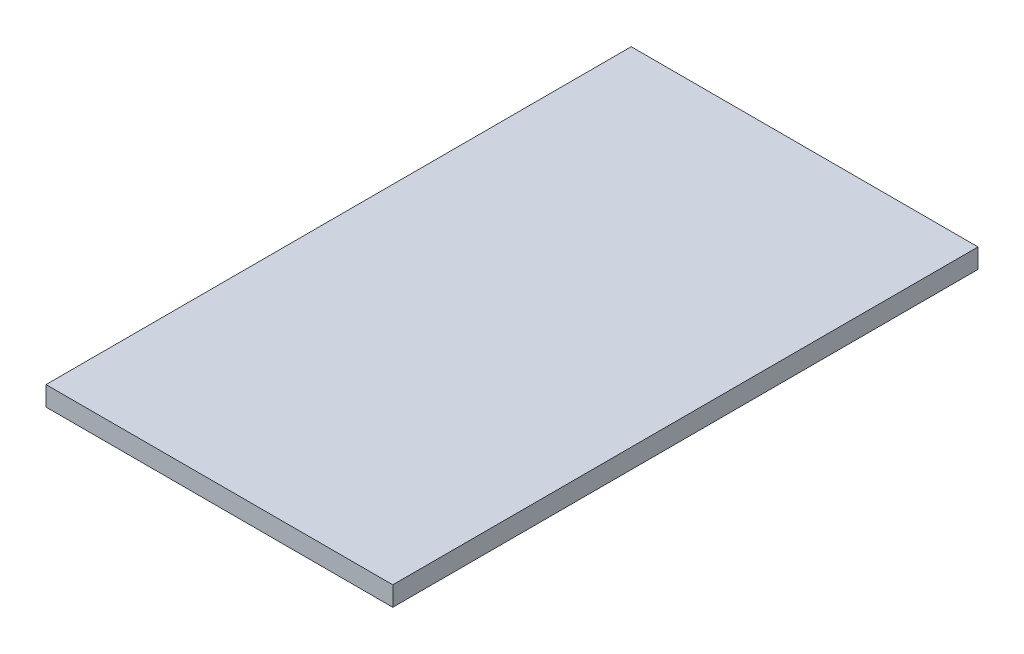
ISO-10303-21;
HEADER;
FILE_DESCRIPTION(('STEP AP214'),'2;1');
FILE_NAME('part.step','',(''),(''),'','','');
FILE_SCHEMA(('AUTOMOTIVE_DESIGN { 1 0 10303 214 1 1 1 1 }'));
ENDSEC;
DATA;
#1=APPLICATION_CONTEXT('core data for automotive mechanical design processes');
#2=APPLICATION_PROTOCOL_DEFINITION('international standard','automotive_design',2000,#1);
#3=PRODUCT_CONTEXT('',#1,'mechanical');
#4=PRODUCT('Part','Part','',(#3));
#5=PRODUCT_RELATED_PRODUCT_CATEGORY('part','',(#4));
#6=PRODUCT_DEFINITION_FORMATION('','',#4);
#7=PRODUCT_DEFINITION_CONTEXT('part definition',#1,'design');
#8=PRODUCT_DEFINITION('design','',#6,#7);
#9=PRODUCT_DEFINITION_SHAPE('','',#8);
#10=(LENGTH_UNIT() NAMED_UNIT(*) SI_UNIT(.MILLI.,.METRE.));
#11=(NAMED_UNIT(*) PLANE_ANGLE_UNIT() SI_UNIT($,.RADIAN.));
#12=(NAMED_UNIT(*) SI_UNIT($,.STERADIAN.) SOLID_ANGLE_UNIT());
#13=UNCERTAINTY_MEASURE_WITH_UNIT(LENGTH_MEASURE(1.E-05),#10,'distance_accuracy_value','');
#14=(GEOMETRIC_REPRESENTATION_CONTEXT(3) GLOBAL_UNCERTAINTY_ASSIGNED_CONTEXT((#13)) GLOBAL_UNIT_ASSIGNED_CONTEXT((#10,
#11,#12)) REPRESENTATION_CONTEXT('',''));
#15=CARTESIAN_POINT('',(0.,0.,0.));
#16=DIRECTION('',(0.,0.,1.));
#17=DIRECTION('',(1.,0.,0.));
#18=AXIS2_PLACEMENT_3D('',#15,#16,#17);
#19=CARTESIAN_POINT('',(-80.,4.5,-135.));
#20=DIRECTION('',(1.,0.,0.));
#21=DIRECTION('',(0.,0.,-1.));
#22=AXIS2_PLACEMENT_3D('',#19,#20,#21);
#23=PLANE('',#22);
#24=DIRECTION('',(0.,0.,1.));
#25=VECTOR('',#24,1.);
#26=CARTESIAN_POINT('',(-80.,-4.5,-135.));
#27=LINE('',#26,#25);
#28=CARTESIAN_POINT('',(-80.,-4.5,-135.));
#29=VERTEX_POINT('',#28);
#30=CARTESIAN_POINT('',(-80.,-4.5,135.));
#31=VERTEX_POINT('',#30);
#32=EDGE_CURVE('E97',#29,#31,#27,.T.);
#33=ORIENTED_EDGE('',*,*,#32,.T.);
#34=DIRECTION('',(0.,-1.,0.));
#35=VECTOR('',#34,1.);
#36=CARTESIAN_POINT('',(-80.,4.5,135.));
#37=LINE('',#36,#35);
#38=CARTESIAN_POINT('',(-80.,4.5,135.));
#39=VERTEX_POINT('',#38);
#40=EDGE_CURVE('E11',#39,#31,#37,.T.);
#41=ORIENTED_EDGE('',*,*,#40,.F.);
#42=DIRECTION('',(0.,0.,1.));
#43=VECTOR('',#42,1.);
#44=CARTESIAN_POINT('',(-80.,4.5,-135.));
#45=LINE('',#44,#43);
#46=CARTESIAN_POINT('',(-80.,4.5,-135.));
#47=VERTEX_POINT('',#46);
#48=EDGE_CURVE('E85',#47,#39,#45,.T.);
#49=ORIENTED_EDGE('',*,*,#48,.F.);
#50=DIRECTION('',(0.,-1.,0.));
#51=VECTOR('',#50,1.);
#52=CARTESIAN_POINT('',(-80.,4.5,-135.));
#53=LINE('',#52,#51);
#54=EDGE_CURVE('E93',#47,#29,#53,.T.);
#55=ORIENTED_EDGE('',*,*,#54,.T.);
#56=EDGE_LOOP('',(#33,#41,#49,#55));
#57=FACE_BOUND('',#56,.T.);
#58=ADVANCED_FACE('F34',(#57),#23,.F.);
#59=CARTESIAN_POINT('',(-80.,4.5,135.));
#60=DIRECTION('',(0.,0.,-1.));
#61=DIRECTION('',(-1.,0.,0.));
#62=AXIS2_PLACEMENT_3D('',#59,#60,#61);
#63=PLANE('',#62);
#64=DIRECTION('',(1.,0.,0.));
#65=VECTOR('',#64,1.);
#66=CARTESIAN_POINT('',(-80.,-4.5,135.));
#67=LINE('',#66,#65);
#68=CARTESIAN_POINT('',(80.,-4.5,135.));
#69=VERTEX_POINT('',#68);
#70=EDGE_CURVE('E89',#31,#69,#67,.T.);
#71=ORIENTED_EDGE('',*,*,#70,.T.);
#72=DIRECTION('',(0.,-1.,0.));
#73=VECTOR('',#72,1.);
#74=CARTESIAN_POINT('',(80.,4.5,135.));
#75=LINE('',#74,#73);
#76=CARTESIAN_POINT('',(80.,4.5,135.));
#77=VERTEX_POINT('',#76);
#78=EDGE_CURVE('E42',#77,#69,#75,.T.);
#79=ORIENTED_EDGE('',*,*,#78,.F.);
#80=DIRECTION('',(1.,0.,0.));
#81=VECTOR('',#80,1.);
#82=CARTESIAN_POINT('',(-80.,4.5,135.));
#83=LINE('',#82,#81);
#84=EDGE_CURVE('E80',#39,#77,#83,.T.);
#85=ORIENTED_EDGE('',*,*,#84,.F.);
#86=ORIENTED_EDGE('',*,*,#40,.T.);
#87=EDGE_LOOP('',(#71,#79,#85,#86));
#88=FACE_BOUND('',#87,.T.);
#89=ADVANCED_FACE('F88',(#88),#63,.F.);
#90=CARTESIAN_POINT('',(80.,4.5,-135.));
#91=DIRECTION('',(-1.,0.,0.));
#92=DIRECTION('',(0.,0.,1.));
#93=AXIS2_PLACEMENT_3D('',#90,#91,#92);
#94=PLANE('',#93);
#95=DIRECTION('',(0.,0.,-1.));
#96=VECTOR('',#95,1.);
#97=CARTESIAN_POINT('',(80.,-4.5,-135.));
#98=LINE('',#97,#96);
#99=CARTESIAN_POINT('',(80.,-4.5,-135.));
#100=VERTEX_POINT('',#99);
#101=EDGE_CURVE('E67',#69,#100,#98,.T.);
#102=ORIENTED_EDGE('',*,*,#101,.T.);
#103=DIRECTION('',(0.,-1.,0.));
#104=VECTOR('',#103,1.);
#105=CARTESIAN_POINT('',(80.,4.5,-135.));
#106=LINE('',#105,#104);
#107=CARTESIAN_POINT('',(80.,4.5,-135.));
#108=VERTEX_POINT('',#107);
#109=EDGE_CURVE('E90',#108,#100,#106,.T.);
#110=ORIENTED_EDGE('',*,*,#109,.F.);
#111=DIRECTION('',(0.,0.,-1.));
#112=VECTOR('',#111,1.);
#113=CARTESIAN_POINT('',(80.,4.5,-135.));
#114=LINE('',#113,#112);
#115=EDGE_CURVE('E83',#77,#108,#114,.T.);
#116=ORIENTED_EDGE('',*,*,#115,.F.);
#117=ORIENTED_EDGE('',*,*,#78,.T.);
#118=EDGE_LOOP('',(#102,#110,#116,#117));
#119=FACE_BOUND('',#118,.T.);
#120=ADVANCED_FACE('F91',(#119),#94,.F.);
#121=CARTESIAN_POINT('',(-80.,4.5,-135.));
#122=DIRECTION('',(0.,0.,1.));
#123=DIRECTION('',(1.,0.,0.));
#124=AXIS2_PLACEMENT_3D('',#121,#122,#123);
#125=PLANE('',#124);
#126=DIRECTION('',(-1.,0.,0.));
#127=VECTOR('',#126,1.);
#128=CARTESIAN_POINT('',(-80.,-4.5,-135.));
#129=LINE('',#128,#127);
#130=EDGE_CURVE('E73',#100,#29,#129,.T.);
#131=ORIENTED_EDGE('',*,*,#130,.T.);
#132=ORIENTED_EDGE('',*,*,#54,.F.);
#133=DIRECTION('',(-1.,0.,0.));
#134=VECTOR('',#133,1.);
#135=CARTESIAN_POINT('',(-80.,4.5,-135.));
#136=LINE('',#135,#134);
#137=EDGE_CURVE('E50',#108,#47,#136,.T.);
#138=ORIENTED_EDGE('',*,*,#137,.F.);
#139=ORIENTED_EDGE('',*,*,#109,.T.);
#140=EDGE_LOOP('',(#131,#132,#138,#139));
#141=FACE_BOUND('',#140,.T.);
#142=ADVANCED_FACE('F104',(#141),#125,.F.);
#143=CARTESIAN_POINT('',(0.,4.5,0.));
#144=DIRECTION('',(0.,1.,0.));
#145=DIRECTION('',(0.,0.,1.));
#146=AXIS2_PLACEMENT_3D('',#143,#144,#145);
#147=PLANE('',#146);
#148=ORIENTED_EDGE('',*,*,#48,.T.);
#149=ORIENTED_EDGE('',*,*,#84,.T.);
#150=ORIENTED_EDGE('',*,*,#115,.T.);
#151=ORIENTED_EDGE('',*,*,#137,.T.);
#152=EDGE_LOOP('',(#148,#149,#150,#151));
#153=FACE_BOUND('',#152,.T.);
#154=ADVANCED_FACE('F81',(#153),#147,.T.);
#155=CARTESIAN_POINT('',(0.,-4.5,0.));
#156=DIRECTION('',(0.,1.,0.));
#157=DIRECTION('',(0.,0.,1.));
#158=AXIS2_PLACEMENT_3D('',#155,#156,#157);
#159=PLANE('',#158);
#160=ORIENTED_EDGE('',*,*,#32,.F.);
#161=ORIENTED_EDGE('',*,*,#130,.F.);
#162=ORIENTED_EDGE('',*,*,#101,.F.);
#163=ORIENTED_EDGE('',*,*,#70,.F.);
#164=EDGE_LOOP('',(#160,#161,#162,#163));
#165=FACE_BOUND('',#164,.T.);
#166=ADVANCED_FACE('F107',(#165),#159,.F.);
#167=CLOSED_SHELL('',(#58,#89,#120,#142,#154,#166));
#168=MANIFOLD_SOLID_BREP('B2',#167);
#169=ADVANCED_BREP_SHAPE_REPRESENTATION('',(#18,#168),#14);
#170=SHAPE_DEFINITION_REPRESENTATION(#9,#169);
ENDSEC;
END-ISO-10303-21;
